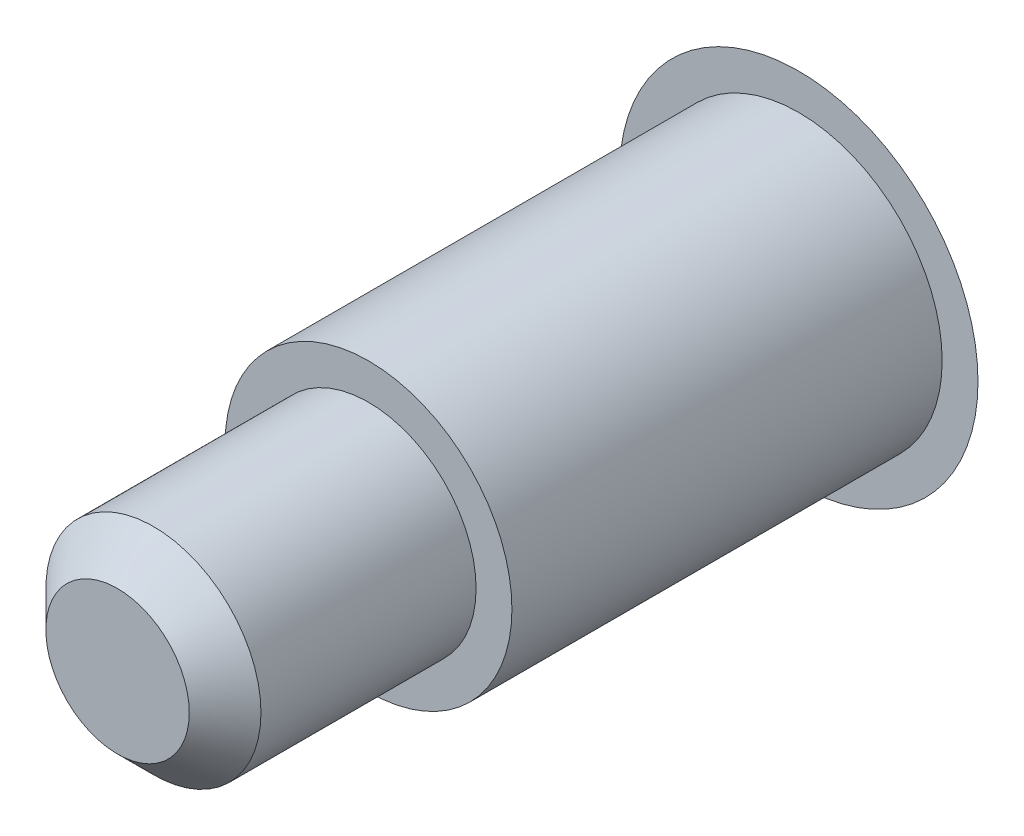
ISO-10303-21;
HEADER;
FILE_DESCRIPTION(('STEP AP214'),'2;1');
FILE_NAME('part.step','',(''),(''),'','','');
FILE_SCHEMA(('AUTOMOTIVE_DESIGN { 1 0 10303 214 1 1 1 1 }'));
ENDSEC;
DATA;
#1=APPLICATION_CONTEXT('core data for automotive mechanical design processes');
#2=APPLICATION_PROTOCOL_DEFINITION('international standard','automotive_design',2000,#1);
#3=PRODUCT_CONTEXT('',#1,'mechanical');
#4=PRODUCT('Part','Part','',(#3));
#5=PRODUCT_RELATED_PRODUCT_CATEGORY('part','',(#4));
#6=PRODUCT_DEFINITION_FORMATION('','',#4);
#7=PRODUCT_DEFINITION_CONTEXT('part definition',#1,'design');
#8=PRODUCT_DEFINITION('design','',#6,#7);
#9=PRODUCT_DEFINITION_SHAPE('','',#8);
#10=(LENGTH_UNIT() NAMED_UNIT(*) SI_UNIT(.MILLI.,.METRE.));
#11=(NAMED_UNIT(*) PLANE_ANGLE_UNIT() SI_UNIT($,.RADIAN.));
#12=(NAMED_UNIT(*) SI_UNIT($,.STERADIAN.) SOLID_ANGLE_UNIT());
#13=UNCERTAINTY_MEASURE_WITH_UNIT(LENGTH_MEASURE(1.E-05),#10,'distance_accuracy_value','');
#14=(GEOMETRIC_REPRESENTATION_CONTEXT(3) GLOBAL_UNCERTAINTY_ASSIGNED_CONTEXT((#13)) GLOBAL_UNIT_ASSIGNED_CONTEXT((#10,
#11,#12)) REPRESENTATION_CONTEXT('',''));
#15=CARTESIAN_POINT('',(0.,0.,0.));
#16=DIRECTION('',(0.,0.,1.));
#17=DIRECTION('',(1.,0.,0.));
#18=AXIS2_PLACEMENT_3D('',#15,#16,#17);
#19=CARTESIAN_POINT('',(0.,0.,0.));
#20=DIRECTION('',(0.,0.,-1.));
#21=DIRECTION('',(-1.,0.,0.));
#22=AXIS2_PLACEMENT_3D('',#19,#20,#21);
#23=PLANE('',#22);
#24=CARTESIAN_POINT('',(0.,0.,0.));
#25=DIRECTION('',(0.,0.,1.));
#26=DIRECTION('',(1.,0.,0.));
#27=AXIS2_PLACEMENT_3D('',#24,#25,#26);
#28=CIRCLE('',#27,1.5);
#29=CARTESIAN_POINT('',(1.5,0.,0.));
#30=VERTEX_POINT('',#29);
#31=EDGE_CURVE('E53',#30,#30,#28,.T.);
#32=ORIENTED_EDGE('',*,*,#31,.F.);
#33=EDGE_LOOP('',(#32));
#34=FACE_BOUND('',#33,.T.);
#35=CARTESIAN_POINT('',(0.,0.,0.));
#36=DIRECTION('',(0.,0.,1.));
#37=DIRECTION('',(1.,0.,0.));
#38=AXIS2_PLACEMENT_3D('',#35,#36,#37);
#39=CIRCLE('',#38,2.);
#40=CARTESIAN_POINT('',(2.,0.,0.));
#41=VERTEX_POINT('',#40);
#42=EDGE_CURVE('E57',#41,#41,#39,.T.);
#43=ORIENTED_EDGE('',*,*,#42,.T.);
#44=EDGE_LOOP('',(#43));
#45=FACE_BOUND('',#44,.T.);
#46=ADVANCED_FACE('F41',(#34,#45),#23,.F.);
#47=CARTESIAN_POINT('',(0.,0.,0.));
#48=DIRECTION('',(0.,0.,1.));
#49=DIRECTION('',(1.,0.,0.));
#50=AXIS2_PLACEMENT_3D('',#47,#48,#49);
#51=CYLINDRICAL_SURFACE('',#50,2.);
#52=ORIENTED_EDGE('',*,*,#42,.F.);
#53=EDGE_LOOP('',(#52));
#54=FACE_BOUND('',#53,.T.);
#55=CARTESIAN_POINT('',(0.,0.,-6.));
#56=DIRECTION('',(0.,0.,1.));
#57=DIRECTION('',(1.,0.,0.));
#58=AXIS2_PLACEMENT_3D('',#55,#56,#57);
#59=CIRCLE('',#58,2.);
#60=CARTESIAN_POINT('',(2.,0.,-6.));
#61=VERTEX_POINT('',#60);
#62=EDGE_CURVE('E62',#61,#61,#59,.T.);
#63=ORIENTED_EDGE('',*,*,#62,.T.);
#64=EDGE_LOOP('',(#63));
#65=FACE_BOUND('',#64,.T.);
#66=ADVANCED_FACE('F88',(#54,#65),#51,.T.);
#67=CARTESIAN_POINT('',(-2.,0.,-6.));
#68=DIRECTION('',(0.,0.,-1.));
#69=DIRECTION('',(-1.,0.,0.));
#70=AXIS2_PLACEMENT_3D('',#67,#68,#69);
#71=PLANE('',#70);
#72=ORIENTED_EDGE('',*,*,#62,.F.);
#73=EDGE_LOOP('',(#72));
#74=FACE_BOUND('',#73,.T.);
#75=CARTESIAN_POINT('',(0.,0.,-6.));
#76=DIRECTION('',(0.,0.,1.));
#77=DIRECTION('',(1.,0.,0.));
#78=AXIS2_PLACEMENT_3D('',#75,#76,#77);
#79=CIRCLE('',#78,2.5);
#80=CARTESIAN_POINT('',(2.5,0.,-6.));
#81=VERTEX_POINT('',#80);
#82=EDGE_CURVE('E65',#81,#81,#79,.T.);
#83=ORIENTED_EDGE('',*,*,#82,.T.);
#84=EDGE_LOOP('',(#83));
#85=FACE_BOUND('',#84,.T.);
#86=ADVANCED_FACE('F85',(#74,#85),#71,.F.);
#87=CARTESIAN_POINT('',(0.,0.,-2.25000000000002));
#88=DIRECTION('',(0.,0.,1.));
#89=DIRECTION('',(1.,0.,0.));
#90=AXIS2_PLACEMENT_3D('',#87,#88,#89);
#91=DEGENERATE_TOROIDAL_SURFACE('',#90,0.500000000000003,4.24999999999998,.T.);
#92=ORIENTED_EDGE('',*,*,#82,.F.);
#93=EDGE_LOOP('',(#92));
#94=FACE_BOUND('',#93,.T.);
#95=CARTESIAN_POINT('',(0.,0.,-6.5));
#96=DIRECTION('',(0.,0.,1.));
#97=DIRECTION('',(1.,0.,0.));
#98=AXIS2_PLACEMENT_3D('',#95,#96,#97);
#99=CIRCLE('',#98,0.500000000000003);
#100=CARTESIAN_POINT('',(0.500000000000003,0.,-6.5));
#101=VERTEX_POINT('',#100);
#102=EDGE_CURVE('E68',#101,#101,#99,.T.);
#103=ORIENTED_EDGE('',*,*,#102,.T.);
#104=EDGE_LOOP('',(#103));
#105=FACE_BOUND('',#104,.T.);
#106=ADVANCED_FACE('F72',(#94,#105),#91,.T.);
#107=CARTESIAN_POINT('',(0.,0.,-6.5));
#108=DIRECTION('',(0.,0.,1.));
#109=DIRECTION('',(1.,0.,0.));
#110=AXIS2_PLACEMENT_3D('',#107,#108,#109);
#111=PLANE('',#110);
#112=ORIENTED_EDGE('',*,*,#102,.F.);
#113=EDGE_LOOP('',(#112));
#114=FACE_BOUND('',#113,.T.);
#115=ADVANCED_FACE('F74',(#114),#111,.F.);
#116=CARTESIAN_POINT('',(0.,0.,3.5));
#117=DIRECTION('',(0.,0.,-1.));
#118=DIRECTION('',(-1.,0.,0.));
#119=AXIS2_PLACEMENT_3D('',#116,#117,#118);
#120=CYLINDRICAL_SURFACE('',#119,1.5);
#121=CARTESIAN_POINT('',(0.,0.,3.));
#122=DIRECTION('',(0.,0.,1.));
#123=DIRECTION('',(1.,0.,0.));
#124=AXIS2_PLACEMENT_3D('',#121,#122,#123);
#125=CIRCLE('',#124,1.5);
#126=CARTESIAN_POINT('',(1.5,0.,3.));
#127=VERTEX_POINT('',#126);
#128=EDGE_CURVE('E10',#127,#127,#125,.F.);
#129=ORIENTED_EDGE('',*,*,#128,.T.);
#130=EDGE_LOOP('',(#129));
#131=FACE_BOUND('',#130,.T.);
#132=ORIENTED_EDGE('',*,*,#31,.T.);
#133=EDGE_LOOP('',(#132));
#134=FACE_BOUND('',#133,.T.);
#135=ADVANCED_FACE('F76',(#131,#134),#120,.T.);
#136=CARTESIAN_POINT('',(0.,0.,3.5));
#137=DIRECTION('',(0.,0.,1.));
#138=DIRECTION('',(1.,0.,0.));
#139=AXIS2_PLACEMENT_3D('',#136,#137,#138);
#140=PLANE('',#139);
#141=CARTESIAN_POINT('',(0.,0.,3.5));
#142=DIRECTION('',(0.,0.,1.));
#143=DIRECTION('',(1.,0.,0.));
#144=AXIS2_PLACEMENT_3D('',#141,#142,#143);
#145=CIRCLE('',#144,1.);
#146=CARTESIAN_POINT('',(1.,0.,3.5));
#147=VERTEX_POINT('',#146);
#148=EDGE_CURVE('E49',#147,#147,#145,.T.);
#149=ORIENTED_EDGE('',*,*,#148,.T.);
#150=EDGE_LOOP('',(#149));
#151=FACE_BOUND('',#150,.T.);
#152=ADVANCED_FACE('F83',(#151),#140,.T.);
#153=CARTESIAN_POINT('',(0.,0.,3.5));
#154=DIRECTION('',(0.,0.,-1.));
#155=DIRECTION('',(-1.,0.,0.));
#156=AXIS2_PLACEMENT_3D('',#153,#154,#155);
#157=CONICAL_SURFACE('',#156,1.,0.785398163397446);
#158=ORIENTED_EDGE('',*,*,#128,.F.);
#159=EDGE_LOOP('',(#158));
#160=FACE_BOUND('',#159,.T.);
#161=ORIENTED_EDGE('',*,*,#148,.F.);
#162=EDGE_LOOP('',(#161));
#163=FACE_BOUND('',#162,.T.);
#164=ADVANCED_FACE('F44',(#160,#163),#157,.T.);
#165=CLOSED_SHELL('',(#46,#66,#86,#106,#115,#135,#152,#164));
#166=MANIFOLD_SOLID_BREP('B2',#165);
#167=ADVANCED_BREP_SHAPE_REPRESENTATION('',(#18,#166),#14);
#168=SHAPE_DEFINITION_REPRESENTATION(#9,#167);
ENDSEC;
END-ISO-10303-21;
